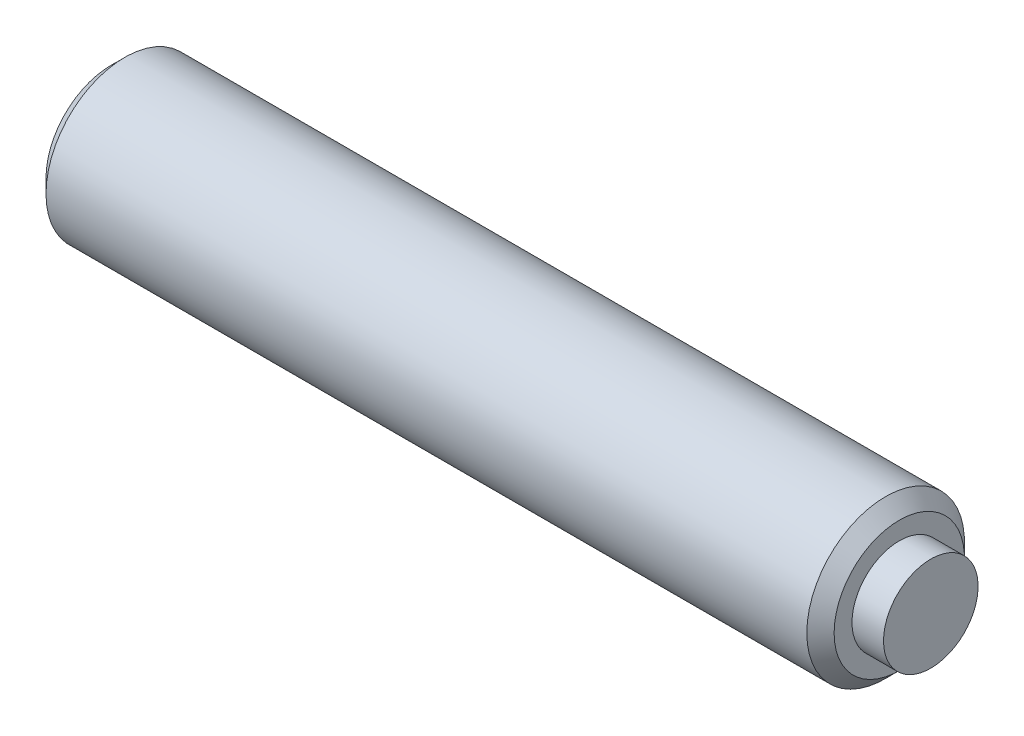
ISO-10303-21;
HEADER;
FILE_DESCRIPTION(('STEP AP214'),'2;1');
FILE_NAME('part.step','',(''),(''),'','','');
FILE_SCHEMA(('AUTOMOTIVE_DESIGN { 1 0 10303 214 1 1 1 1 }'));
ENDSEC;
DATA;
#1=APPLICATION_CONTEXT('core data for automotive mechanical design processes');
#2=APPLICATION_PROTOCOL_DEFINITION('international standard','automotive_design',2000,#1);
#3=PRODUCT_CONTEXT('',#1,'mechanical');
#4=PRODUCT('Part','Part','',(#3));
#5=PRODUCT_RELATED_PRODUCT_CATEGORY('part','',(#4));
#6=PRODUCT_DEFINITION_FORMATION('','',#4);
#7=PRODUCT_DEFINITION_CONTEXT('part definition',#1,'design');
#8=PRODUCT_DEFINITION('design','',#6,#7);
#9=PRODUCT_DEFINITION_SHAPE('','',#8);
#10=(LENGTH_UNIT() NAMED_UNIT(*) SI_UNIT(.MILLI.,.METRE.));
#11=(NAMED_UNIT(*) PLANE_ANGLE_UNIT() SI_UNIT($,.RADIAN.));
#12=(NAMED_UNIT(*) SI_UNIT($,.STERADIAN.) SOLID_ANGLE_UNIT());
#13=UNCERTAINTY_MEASURE_WITH_UNIT(LENGTH_MEASURE(1.E-05),#10,'distance_accuracy_value','');
#14=(GEOMETRIC_REPRESENTATION_CONTEXT(3) GLOBAL_UNCERTAINTY_ASSIGNED_CONTEXT((#13)) GLOBAL_UNIT_ASSIGNED_CONTEXT((#10,
#11,#12)) REPRESENTATION_CONTEXT('',''));
#15=CARTESIAN_POINT('',(0.,0.,0.));
#16=DIRECTION('',(0.,0.,1.));
#17=DIRECTION('',(1.,0.,0.));
#18=AXIS2_PLACEMENT_3D('',#15,#16,#17);
#19=CARTESIAN_POINT('',(12.5,2.067,0.));
#20=DIRECTION('',(-1.,0.,0.));
#21=DIRECTION('',(0.,0.,1.));
#22=AXIS2_PLACEMENT_3D('',#19,#20,#21);
#23=PLANE('',#22);
#24=CARTESIAN_POINT('',(12.5,0.,0.));
#25=DIRECTION('',(-1.,0.,0.));
#26=DIRECTION('',(0.,0.,1.));
#27=AXIS2_PLACEMENT_3D('',#24,#25,#26);
#28=CIRCLE('',#27,2.067);
#29=CARTESIAN_POINT('',(12.5,0.,2.067));
#30=VERTEX_POINT('',#29);
#31=EDGE_CURVE('E153',#30,#30,#28,.T.);
#32=ORIENTED_EDGE('',*,*,#31,.F.);
#33=EDGE_LOOP('',(#32));
#34=FACE_BOUND('',#33,.T.);
#35=CARTESIAN_POINT('',(12.5,0.,0.));
#36=DIRECTION('',(-1.,0.,0.));
#37=DIRECTION('',(0.,0.,1.));
#38=AXIS2_PLACEMENT_3D('',#35,#36,#37);
#39=CIRCLE('',#38,1.5);
#40=CARTESIAN_POINT('',(12.5,0.,1.5));
#41=VERTEX_POINT('',#40);
#42=EDGE_CURVE('E11',#41,#41,#39,.F.);
#43=ORIENTED_EDGE('',*,*,#42,.F.);
#44=EDGE_LOOP('',(#43));
#45=FACE_BOUND('',#44,.T.);
#46=ADVANCED_FACE('F17',(#34,#45),#23,.F.);
#47=CARTESIAN_POINT('',(-9.5,0.72168783648703,1.25));
#48=DIRECTION('',(1.,0.,0.));
#49=DIRECTION('',(0.,0.,-1.));
#50=AXIS2_PLACEMENT_3D('',#47,#48,#49);
#51=PLANE('',#50);
#52=CARTESIAN_POINT('',(-9.5,0.,0.));
#53=DIRECTION('',(-1.,0.,0.));
#54=DIRECTION('',(0.,0.,1.));
#55=AXIS2_PLACEMENT_3D('',#52,#53,#54);
#56=CIRCLE('',#55,1.25);
#57=CARTESIAN_POINT('',(-9.5,0.,1.25));
#58=VERTEX_POINT('',#57);
#59=CARTESIAN_POINT('',(-9.5,1.08253175473053,0.625000000000025));
#60=VERTEX_POINT('',#59);
#61=EDGE_CURVE('E188',#58,#60,#56,.T.);
#62=ORIENTED_EDGE('',*,*,#61,.F.);
#63=DIRECTION('',(0.,-1.,0.));
#64=VECTOR('',#63,1.);
#65=CARTESIAN_POINT('',(-9.5,0.72168783648703,1.25));
#66=LINE('',#65,#64);
#67=CARTESIAN_POINT('',(-9.5,0.72168783648703,1.25));
#68=VERTEX_POINT('',#67);
#69=EDGE_CURVE('E204',#68,#58,#66,.T.);
#70=ORIENTED_EDGE('',*,*,#69,.F.);
#71=DIRECTION('',(0.,-0.50000000000002,0.866025403784427));
#72=VECTOR('',#71,1.);
#73=CARTESIAN_POINT('',(-9.5,1.4433756729741,0.));
#74=LINE('',#73,#72);
#75=EDGE_CURVE('E174',#60,#68,#74,.T.);
#76=ORIENTED_EDGE('',*,*,#75,.F.);
#77=EDGE_LOOP('',(#62,#70,#76));
#78=FACE_BOUND('',#77,.T.);
#79=ADVANCED_FACE('F111',(#78),#51,.F.);
#80=CARTESIAN_POINT('',(-9.5,1.08253175473053,-0.625000000000025));
#81=VERTEX_POINT('',#80);
#82=EDGE_CURVE('E25',#60,#81,#56,.T.);
#83=ORIENTED_EDGE('',*,*,#82,.F.);
#84=CARTESIAN_POINT('',(-9.5,1.4433756729741,0.));
#85=VERTEX_POINT('',#84);
#86=EDGE_CURVE('E208',#85,#60,#74,.T.);
#87=ORIENTED_EDGE('',*,*,#86,.F.);
#88=DIRECTION('',(0.,0.50000000000002,0.866025403784427));
#89=VECTOR('',#88,1.);
#90=CARTESIAN_POINT('',(-9.5,0.72168783648703,-1.25));
#91=LINE('',#90,#89);
#92=EDGE_CURVE('E191',#81,#85,#91,.T.);
#93=ORIENTED_EDGE('',*,*,#92,.F.);
#94=EDGE_LOOP('',(#83,#87,#93));
#95=FACE_BOUND('',#94,.T.);
#96=ADVANCED_FACE('F118',(#95),#51,.F.);
#97=CARTESIAN_POINT('',(-9.5,0.,-1.25));
#98=VERTEX_POINT('',#97);
#99=EDGE_CURVE('E418',#81,#98,#56,.T.);
#100=ORIENTED_EDGE('',*,*,#99,.F.);
#101=CARTESIAN_POINT('',(-9.5,0.72168783648703,-1.25));
#102=VERTEX_POINT('',#101);
#103=EDGE_CURVE('E170',#102,#81,#91,.T.);
#104=ORIENTED_EDGE('',*,*,#103,.F.);
#105=DIRECTION('',(0.,1.,0.));
#106=VECTOR('',#105,1.);
#107=CARTESIAN_POINT('',(-9.5,-0.72168783648703,-1.25));
#108=LINE('',#107,#106);
#109=EDGE_CURVE('E195',#98,#102,#108,.T.);
#110=ORIENTED_EDGE('',*,*,#109,.F.);
#111=EDGE_LOOP('',(#100,#104,#110));
#112=FACE_BOUND('',#111,.T.);
#113=ADVANCED_FACE('F291',(#112),#51,.F.);
#114=CARTESIAN_POINT('',(-9.5,-1.08253175473053,-0.625000000000025));
#115=VERTEX_POINT('',#114);
#116=EDGE_CURVE('E431',#98,#115,#56,.T.);
#117=ORIENTED_EDGE('',*,*,#116,.F.);
#118=CARTESIAN_POINT('',(-9.5,-0.72168783648703,-1.25));
#119=VERTEX_POINT('',#118);
#120=EDGE_CURVE('E192',#119,#98,#108,.T.);
#121=ORIENTED_EDGE('',*,*,#120,.F.);
#122=DIRECTION('',(0.,0.50000000000002,-0.866025403784427));
#123=VECTOR('',#122,1.);
#124=CARTESIAN_POINT('',(-9.5,-1.4433756729741,0.));
#125=LINE('',#124,#123);
#126=EDGE_CURVE('E199',#115,#119,#125,.T.);
#127=ORIENTED_EDGE('',*,*,#126,.F.);
#128=EDGE_LOOP('',(#117,#121,#127));
#129=FACE_BOUND('',#128,.T.);
#130=ADVANCED_FACE('F299',(#129),#51,.F.);
#131=CARTESIAN_POINT('',(-9.5,-1.08253175473055,0.625000000000032));
#132=VERTEX_POINT('',#131);
#133=EDGE_CURVE('E32',#115,#132,#56,.T.);
#134=ORIENTED_EDGE('',*,*,#133,.F.);
#135=CARTESIAN_POINT('',(-9.5,-1.4433756729741,0.));
#136=VERTEX_POINT('',#135);
#137=EDGE_CURVE('E196',#136,#115,#125,.T.);
#138=ORIENTED_EDGE('',*,*,#137,.F.);
#139=DIRECTION('',(0.,-0.50000000000002,-0.866025403784427));
#140=VECTOR('',#139,1.);
#141=CARTESIAN_POINT('',(-9.5,-0.72168783648703,1.25));
#142=LINE('',#141,#140);
#143=EDGE_CURVE('E203',#132,#136,#142,.T.);
#144=ORIENTED_EDGE('',*,*,#143,.F.);
#145=EDGE_LOOP('',(#134,#138,#144));
#146=FACE_BOUND('',#145,.T.);
#147=ADVANCED_FACE('F306',(#146),#51,.F.);
#148=EDGE_CURVE('E151',#132,#58,#56,.T.);
#149=ORIENTED_EDGE('',*,*,#148,.F.);
#150=CARTESIAN_POINT('',(-9.5,-0.72168783648703,1.25));
#151=VERTEX_POINT('',#150);
#152=EDGE_CURVE('E200',#151,#132,#142,.T.);
#153=ORIENTED_EDGE('',*,*,#152,.F.);
#154=EDGE_CURVE('E207',#58,#151,#66,.T.);
#155=ORIENTED_EDGE('',*,*,#154,.F.);
#156=EDGE_LOOP('',(#149,#153,#155));
#157=FACE_BOUND('',#156,.T.);
#158=ADVANCED_FACE('F120',(#157),#51,.F.);
#159=CARTESIAN_POINT('',(-12.5,0.,0.));
#160=DIRECTION('',(1.,0.,0.));
#161=DIRECTION('',(0.,0.,-1.));
#162=AXIS2_PLACEMENT_3D('',#159,#160,#161);
#163=PLANE('',#162);
#164=CARTESIAN_POINT('',(-12.5,0.,0.));
#165=DIRECTION('',(-1.,0.,0.));
#166=DIRECTION('',(0.,0.,1.));
#167=AXIS2_PLACEMENT_3D('',#164,#165,#166);
#168=CIRCLE('',#167,2.067);
#169=CARTESIAN_POINT('',(-12.5,0.,2.067));
#170=VERTEX_POINT('',#169);
#171=EDGE_CURVE('E145',#170,#170,#168,.T.);
#172=ORIENTED_EDGE('',*,*,#171,.T.);
#173=EDGE_LOOP('',(#172));
#174=FACE_BOUND('',#173,.T.);
#175=DIRECTION('',(0.,-0.50000000000002,0.866025403784427));
#176=VECTOR('',#175,1.);
#177=CARTESIAN_POINT('',(-12.5,1.4433756729741,0.));
#178=LINE('',#177,#176);
#179=CARTESIAN_POINT('',(-12.5,1.4433756729741,0.));
#180=VERTEX_POINT('',#179);
#181=CARTESIAN_POINT('',(-12.5,0.72168783648703,1.25));
#182=VERTEX_POINT('',#181);
#183=EDGE_CURVE('E40',#180,#182,#178,.T.);
#184=ORIENTED_EDGE('',*,*,#183,.T.);
#185=DIRECTION('',(0.,-1.,0.));
#186=VECTOR('',#185,1.);
#187=CARTESIAN_POINT('',(-12.5,0.72168783648703,1.25));
#188=LINE('',#187,#186);
#189=CARTESIAN_POINT('',(-12.5,-0.72168783648703,1.25));
#190=VERTEX_POINT('',#189);
#191=EDGE_CURVE('E184',#182,#190,#188,.T.);
#192=ORIENTED_EDGE('',*,*,#191,.T.);
#193=DIRECTION('',(0.,-0.50000000000002,-0.866025403784427));
#194=VECTOR('',#193,1.);
#195=CARTESIAN_POINT('',(-12.5,-0.72168783648703,1.25));
#196=LINE('',#195,#194);
#197=CARTESIAN_POINT('',(-12.5,-1.4433756729741,0.));
#198=VERTEX_POINT('',#197);
#199=EDGE_CURVE('E181',#190,#198,#196,.T.);
#200=ORIENTED_EDGE('',*,*,#199,.T.);
#201=DIRECTION('',(0.,0.50000000000002,-0.866025403784427));
#202=VECTOR('',#201,1.);
#203=CARTESIAN_POINT('',(-12.5,-1.4433756729741,0.));
#204=LINE('',#203,#202);
#205=CARTESIAN_POINT('',(-12.5,-0.72168783648703,-1.25));
#206=VERTEX_POINT('',#205);
#207=EDGE_CURVE('E178',#198,#206,#204,.T.);
#208=ORIENTED_EDGE('',*,*,#207,.T.);
#209=DIRECTION('',(0.,1.,0.));
#210=VECTOR('',#209,1.);
#211=CARTESIAN_POINT('',(-12.5,-0.72168783648703,-1.25));
#212=LINE('',#211,#210);
#213=CARTESIAN_POINT('',(-12.5,0.72168783648703,-1.25));
#214=VERTEX_POINT('',#213);
#215=EDGE_CURVE('E175',#206,#214,#212,.T.);
#216=ORIENTED_EDGE('',*,*,#215,.T.);
#217=DIRECTION('',(0.,0.50000000000002,0.866025403784427));
#218=VECTOR('',#217,1.);
#219=CARTESIAN_POINT('',(-12.5,0.72168783648703,-1.25));
#220=LINE('',#219,#218);
#221=EDGE_CURVE('E171',#214,#180,#220,.T.);
#222=ORIENTED_EDGE('',*,*,#221,.T.);
#223=EDGE_LOOP('',(#184,#192,#200,#208,#216,#222));
#224=FACE_BOUND('',#223,.T.);
#225=ADVANCED_FACE('F19',(#174,#224),#163,.F.);
#226=CARTESIAN_POINT('',(-12.067,0.,0.));
#227=DIRECTION('',(1.,0.,0.));
#228=DIRECTION('',(0.,0.,-1.));
#229=AXIS2_PLACEMENT_3D('',#226,#227,#228);
#230=CONICAL_SURFACE('',#229,2.5,0.785398163397445);
#231=ORIENTED_EDGE('',*,*,#171,.F.);
#232=EDGE_LOOP('',(#231));
#233=FACE_BOUND('',#232,.T.);
#234=CARTESIAN_POINT('',(-12.067,0.,0.));
#235=DIRECTION('',(-1.,0.,0.));
#236=DIRECTION('',(0.,0.,1.));
#237=AXIS2_PLACEMENT_3D('',#234,#235,#236);
#238=CIRCLE('',#237,2.5);
#239=CARTESIAN_POINT('',(-12.067,0.,2.5));
#240=VERTEX_POINT('',#239);
#241=EDGE_CURVE('E148',#240,#240,#238,.T.);
#242=ORIENTED_EDGE('',*,*,#241,.T.);
#243=EDGE_LOOP('',(#242));
#244=FACE_BOUND('',#243,.T.);
#245=ADVANCED_FACE('F133',(#233,#244),#230,.T.);
#246=CARTESIAN_POINT('',(12.5,0.,0.));
#247=DIRECTION('',(-1.,0.,0.));
#248=DIRECTION('',(0.,0.,1.));
#249=AXIS2_PLACEMENT_3D('',#246,#247,#248);
#250=CYLINDRICAL_SURFACE('',#249,2.5);
#251=ORIENTED_EDGE('',*,*,#241,.F.);
#252=EDGE_LOOP('',(#251));
#253=FACE_BOUND('',#252,.T.);
#254=CARTESIAN_POINT('',(12.067,0.,0.));
#255=DIRECTION('',(-1.,0.,0.));
#256=DIRECTION('',(0.,0.,1.));
#257=AXIS2_PLACEMENT_3D('',#254,#255,#256);
#258=CIRCLE('',#257,2.5);
#259=CARTESIAN_POINT('',(12.067,0.,2.5));
#260=VERTEX_POINT('',#259);
#261=EDGE_CURVE('E149',#260,#260,#258,.T.);
#262=ORIENTED_EDGE('',*,*,#261,.T.);
#263=EDGE_LOOP('',(#262));
#264=FACE_BOUND('',#263,.T.);
#265=ADVANCED_FACE('F130',(#253,#264),#250,.T.);
#266=CARTESIAN_POINT('',(12.5,0.,0.));
#267=DIRECTION('',(-1.,0.,0.));
#268=DIRECTION('',(0.,0.,1.));
#269=AXIS2_PLACEMENT_3D('',#266,#267,#268);
#270=CONICAL_SURFACE('',#269,2.067,0.785398163397448);
#271=ORIENTED_EDGE('',*,*,#261,.F.);
#272=EDGE_LOOP('',(#271));
#273=FACE_BOUND('',#272,.T.);
#274=ORIENTED_EDGE('',*,*,#31,.T.);
#275=EDGE_LOOP('',(#274));
#276=FACE_BOUND('',#275,.T.);
#277=ADVANCED_FACE('F127',(#273,#276),#270,.T.);
#278=CARTESIAN_POINT('',(-9.5,1.4433756729741,0.));
#279=DIRECTION('',(0.,-0.866025403784427,-0.50000000000002));
#280=DIRECTION('',(0.,0.50000000000002,-0.866025403784427));
#281=AXIS2_PLACEMENT_3D('',#278,#279,#280);
#282=PLANE('',#281);
#283=ORIENTED_EDGE('',*,*,#183,.F.);
#284=DIRECTION('',(-1.,0.,0.));
#285=VECTOR('',#284,1.);
#286=CARTESIAN_POINT('',(-9.5,1.4433756729741,0.));
#287=LINE('',#286,#285);
#288=EDGE_CURVE('E168',#85,#180,#287,.T.);
#289=ORIENTED_EDGE('',*,*,#288,.F.);
#290=ORIENTED_EDGE('',*,*,#86,.T.);
#291=ORIENTED_EDGE('',*,*,#75,.T.);
#292=DIRECTION('',(-1.,0.,0.));
#293=VECTOR('',#292,1.);
#294=CARTESIAN_POINT('',(-9.5,0.72168783648703,1.25));
#295=LINE('',#294,#293);
#296=EDGE_CURVE('E158',#68,#182,#295,.T.);
#297=ORIENTED_EDGE('',*,*,#296,.T.);
#298=EDGE_LOOP('',(#283,#289,#290,#291,#297));
#299=FACE_BOUND('',#298,.T.);
#300=ADVANCED_FACE('F125',(#299),#282,.T.);
#301=CARTESIAN_POINT('',(-9.5,0.72168783648703,1.25));
#302=DIRECTION('',(0.,0.,-1.));
#303=DIRECTION('',(-1.,0.,0.));
#304=AXIS2_PLACEMENT_3D('',#301,#302,#303);
#305=PLANE('',#304);
#306=ORIENTED_EDGE('',*,*,#191,.F.);
#307=ORIENTED_EDGE('',*,*,#296,.F.);
#308=ORIENTED_EDGE('',*,*,#69,.T.);
#309=ORIENTED_EDGE('',*,*,#154,.T.);
#310=DIRECTION('',(-1.,0.,0.));
#311=VECTOR('',#310,1.);
#312=CARTESIAN_POINT('',(-9.5,-0.72168783648703,1.25));
#313=LINE('',#312,#311);
#314=EDGE_CURVE('E160',#151,#190,#313,.T.);
#315=ORIENTED_EDGE('',*,*,#314,.T.);
#316=EDGE_LOOP('',(#306,#307,#308,#309,#315));
#317=FACE_BOUND('',#316,.T.);
#318=ADVANCED_FACE('F341',(#317),#305,.T.);
#319=CARTESIAN_POINT('',(-9.5,-0.72168783648703,1.25));
#320=DIRECTION('',(0.,0.866025403784427,-0.50000000000002));
#321=DIRECTION('',(0.,0.50000000000002,0.866025403784427));
#322=AXIS2_PLACEMENT_3D('',#319,#320,#321);
#323=PLANE('',#322);
#324=ORIENTED_EDGE('',*,*,#199,.F.);
#325=ORIENTED_EDGE('',*,*,#314,.F.);
#326=ORIENTED_EDGE('',*,*,#152,.T.);
#327=ORIENTED_EDGE('',*,*,#143,.T.);
#328=DIRECTION('',(-1.,0.,0.));
#329=VECTOR('',#328,1.);
#330=CARTESIAN_POINT('',(-9.5,-1.4433756729741,0.));
#331=LINE('',#330,#329);
#332=EDGE_CURVE('E162',#136,#198,#331,.T.);
#333=ORIENTED_EDGE('',*,*,#332,.T.);
#334=EDGE_LOOP('',(#324,#325,#326,#327,#333));
#335=FACE_BOUND('',#334,.T.);
#336=ADVANCED_FACE('F333',(#335),#323,.T.);
#337=CARTESIAN_POINT('',(-9.5,-1.4433756729741,0.));
#338=DIRECTION('',(0.,0.866025403784427,0.50000000000002));
#339=DIRECTION('',(0.,-0.50000000000002,0.866025403784427));
#340=AXIS2_PLACEMENT_3D('',#337,#338,#339);
#341=PLANE('',#340);
#342=ORIENTED_EDGE('',*,*,#207,.F.);
#343=ORIENTED_EDGE('',*,*,#332,.F.);
#344=ORIENTED_EDGE('',*,*,#137,.T.);
#345=ORIENTED_EDGE('',*,*,#126,.T.);
#346=DIRECTION('',(-1.,0.,0.));
#347=VECTOR('',#346,1.);
#348=CARTESIAN_POINT('',(-9.5,-0.72168783648703,-1.25));
#349=LINE('',#348,#347);
#350=EDGE_CURVE('E164',#119,#206,#349,.T.);
#351=ORIENTED_EDGE('',*,*,#350,.T.);
#352=EDGE_LOOP('',(#342,#343,#344,#345,#351));
#353=FACE_BOUND('',#352,.T.);
#354=ADVANCED_FACE('F325',(#353),#341,.T.);
#355=CARTESIAN_POINT('',(-9.5,-0.72168783648703,-1.25));
#356=DIRECTION('',(0.,0.,1.));
#357=DIRECTION('',(1.,0.,0.));
#358=AXIS2_PLACEMENT_3D('',#355,#356,#357);
#359=PLANE('',#358);
#360=ORIENTED_EDGE('',*,*,#215,.F.);
#361=ORIENTED_EDGE('',*,*,#350,.F.);
#362=ORIENTED_EDGE('',*,*,#120,.T.);
#363=ORIENTED_EDGE('',*,*,#109,.T.);
#364=DIRECTION('',(-1.,0.,0.));
#365=VECTOR('',#364,1.);
#366=CARTESIAN_POINT('',(-9.5,0.72168783648703,-1.25));
#367=LINE('',#366,#365);
#368=EDGE_CURVE('E166',#102,#214,#367,.T.);
#369=ORIENTED_EDGE('',*,*,#368,.T.);
#370=EDGE_LOOP('',(#360,#361,#362,#363,#369));
#371=FACE_BOUND('',#370,.T.);
#372=ADVANCED_FACE('F106',(#371),#359,.T.);
#373=CARTESIAN_POINT('',(-9.5,0.72168783648703,-1.25));
#374=DIRECTION('',(0.,-0.866025403784427,0.50000000000002));
#375=DIRECTION('',(0.,-0.50000000000002,-0.866025403784427));
#376=AXIS2_PLACEMENT_3D('',#373,#374,#375);
#377=PLANE('',#376);
#378=ORIENTED_EDGE('',*,*,#221,.F.);
#379=ORIENTED_EDGE('',*,*,#368,.F.);
#380=ORIENTED_EDGE('',*,*,#103,.T.);
#381=ORIENTED_EDGE('',*,*,#92,.T.);
#382=ORIENTED_EDGE('',*,*,#288,.T.);
#383=EDGE_LOOP('',(#378,#379,#380,#381,#382));
#384=FACE_BOUND('',#383,.T.);
#385=ADVANCED_FACE('F94',(#384),#377,.T.);
#386=CARTESIAN_POINT('',(-8.778312163513,0.,0.));
#387=DIRECTION('',(-1.,0.,0.));
#388=DIRECTION('',(0.,0.,1.));
#389=AXIS2_PLACEMENT_3D('',#386,#387,#388);
#390=CONICAL_SURFACE('',#389,0.,1.04719755119662);
#391=ORIENTED_EDGE('',*,*,#61,.T.);
#392=ORIENTED_EDGE('',*,*,#82,.T.);
#393=ORIENTED_EDGE('',*,*,#99,.T.);
#394=ORIENTED_EDGE('',*,*,#116,.T.);
#395=ORIENTED_EDGE('',*,*,#133,.T.);
#396=ORIENTED_EDGE('',*,*,#148,.T.);
#397=EDGE_LOOP('',(#391,#392,#393,#394,#395,#396));
#398=FACE_BOUND('',#397,.T.);
#399=CARTESIAN_POINT('',(-8.778312163513,0.,0.));
#400=VERTEX_POINT('',#399);
#401=VERTEX_LOOP('',#400);
#402=FACE_BOUND('',#401,.T.);
#403=ADVANCED_FACE('F91',(#398,#402),#390,.F.);
#404=CARTESIAN_POINT('',(13.5,0.,0.));
#405=DIRECTION('',(-1.,0.,0.));
#406=DIRECTION('',(0.,0.,1.));
#407=AXIS2_PLACEMENT_3D('',#404,#405,#406);
#408=CYLINDRICAL_SURFACE('',#407,1.5);
#409=ORIENTED_EDGE('',*,*,#42,.T.);
#410=EDGE_LOOP('',(#409));
#411=FACE_BOUND('',#410,.T.);
#412=CARTESIAN_POINT('',(13.5,0.,0.));
#413=DIRECTION('',(-1.,0.,0.));
#414=DIRECTION('',(0.,0.,1.));
#415=AXIS2_PLACEMENT_3D('',#412,#413,#414);
#416=CIRCLE('',#415,1.5);
#417=CARTESIAN_POINT('',(13.5,0.,1.5));
#418=VERTEX_POINT('',#417);
#419=EDGE_CURVE('E212',#418,#418,#416,.T.);
#420=ORIENTED_EDGE('',*,*,#419,.T.);
#421=EDGE_LOOP('',(#420));
#422=FACE_BOUND('',#421,.T.);
#423=ADVANCED_FACE('F93',(#411,#422),#408,.T.);
#424=CARTESIAN_POINT('',(13.5,1.5,0.));
#425=DIRECTION('',(-1.,0.,0.));
#426=DIRECTION('',(0.,0.,1.));
#427=AXIS2_PLACEMENT_3D('',#424,#425,#426);
#428=PLANE('',#427);
#429=ORIENTED_EDGE('',*,*,#419,.F.);
#430=EDGE_LOOP('',(#429));
#431=FACE_BOUND('',#430,.T.);
#432=ADVANCED_FACE('F103',(#431),#428,.F.);
#433=CLOSED_SHELL('',(#46,#79,#96,#113,#130,#147,#158,#225,#245,#265,#277,#300,#318,#336,#354,
#372,#385,#403,#423,#432));
#434=MANIFOLD_SOLID_BREP('B1',#433);
#435=ADVANCED_BREP_SHAPE_REPRESENTATION('',(#18,#434),#14);
#436=SHAPE_DEFINITION_REPRESENTATION(#9,#435);
ENDSEC;
END-ISO-10303-21;
